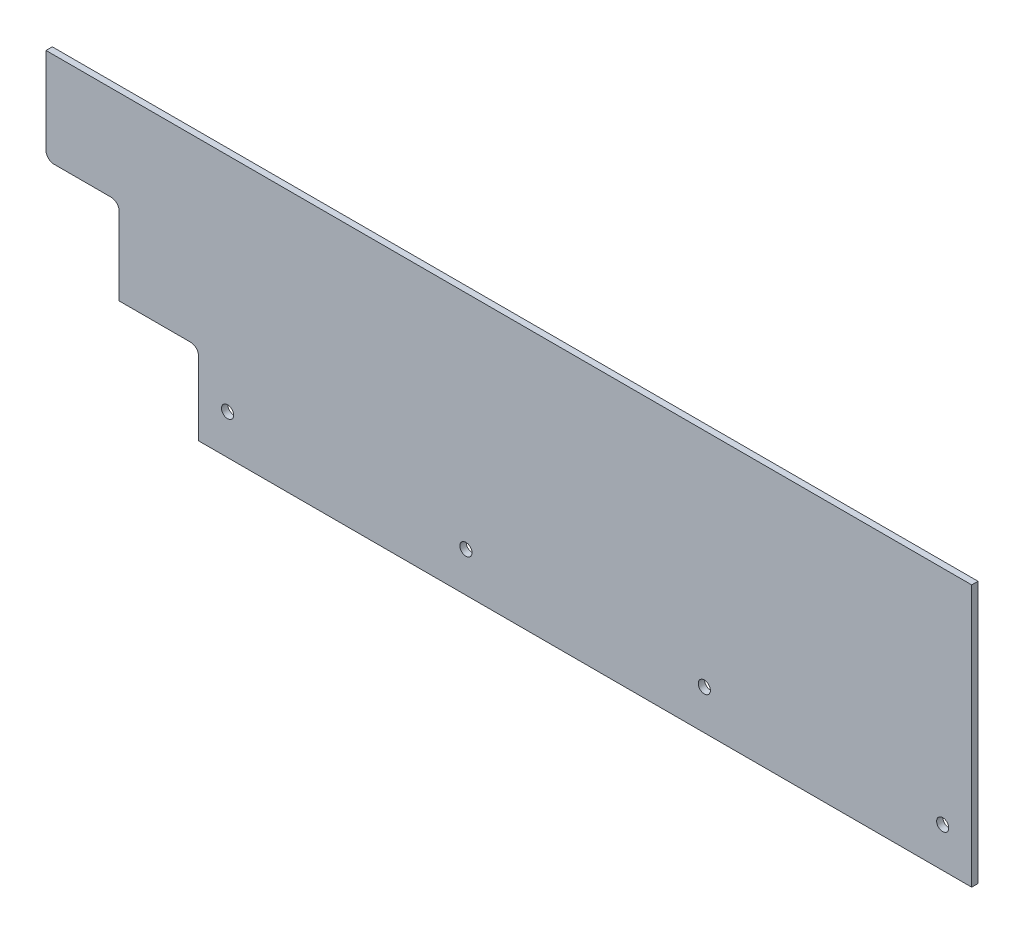
ISO-10303-21;
HEADER;
FILE_DESCRIPTION(('STEP AP214'),'2;1');
FILE_NAME('part.step','',(''),(''),'','','');
FILE_SCHEMA(('AUTOMOTIVE_DESIGN { 1 0 10303 214 1 1 1 1 }'));
ENDSEC;
DATA;
#1=APPLICATION_CONTEXT('core data for automotive mechanical design processes');
#2=APPLICATION_PROTOCOL_DEFINITION('international standard','automotive_design',2000,#1);
#3=PRODUCT_CONTEXT('',#1,'mechanical');
#4=PRODUCT('Part','Part','',(#3));
#5=PRODUCT_RELATED_PRODUCT_CATEGORY('part','',(#4));
#6=PRODUCT_DEFINITION_FORMATION('','',#4);
#7=PRODUCT_DEFINITION_CONTEXT('part definition',#1,'design');
#8=PRODUCT_DEFINITION('design','',#6,#7);
#9=PRODUCT_DEFINITION_SHAPE('','',#8);
#10=(LENGTH_UNIT() NAMED_UNIT(*) SI_UNIT(.MILLI.,.METRE.));
#11=(NAMED_UNIT(*) PLANE_ANGLE_UNIT() SI_UNIT($,.RADIAN.));
#12=(NAMED_UNIT(*) SI_UNIT($,.STERADIAN.) SOLID_ANGLE_UNIT());
#13=UNCERTAINTY_MEASURE_WITH_UNIT(LENGTH_MEASURE(1.E-05),#10,'distance_accuracy_value','');
#14=(GEOMETRIC_REPRESENTATION_CONTEXT(3) GLOBAL_UNCERTAINTY_ASSIGNED_CONTEXT((#13)) GLOBAL_UNIT_ASSIGNED_CONTEXT((#10,
#11,#12)) REPRESENTATION_CONTEXT('',''));
#15=CARTESIAN_POINT('',(0.,0.,0.));
#16=DIRECTION('',(0.,0.,1.));
#17=DIRECTION('',(1.,0.,0.));
#18=AXIS2_PLACEMENT_3D('',#15,#16,#17);
#19=CARTESIAN_POINT('',(-465.99999999998,1.11022302462516E-13,3.17500000000021));
#20=DIRECTION('',(-0.999999999999974,0.,0.));
#21=DIRECTION('',(0.,0.,0.999999999999972));
#22=AXIS2_PLACEMENT_3D('',#19,#20,#21);
#23=PLANE('',#22);
#24=DIRECTION('',(0.,0.999999999999998,0.));
#25=VECTOR('',#24,1.);
#26=CARTESIAN_POINT('',(-465.99999999998,1.66533453693773E-13,1.11022302462516E-13));
#27=LINE('',#26,#25);
#28=CARTESIAN_POINT('',(-465.999999999987,88.2,1.66533453693773E-13));
#29=VERTEX_POINT('',#28);
#30=CARTESIAN_POINT('',(-465.999999999987,131.8,3.33066907387547E-13));
#31=VERTEX_POINT('',#30);
#32=EDGE_CURVE('E169',#29,#31,#27,.T.);
#33=ORIENTED_EDGE('',*,*,#32,.F.);
#34=DIRECTION('',(0.,0.,-0.999999999999972));
#35=VECTOR('',#34,1.);
#36=CARTESIAN_POINT('',(-465.999999999987,88.1999999999999,3.17500000000026));
#37=LINE('',#36,#35);
#38=CARTESIAN_POINT('',(-465.999999999987,88.1999999999999,3.17500000000026));
#39=VERTEX_POINT('',#38);
#40=EDGE_CURVE('E13',#39,#29,#37,.T.);
#41=ORIENTED_EDGE('',*,*,#40,.F.);
#42=DIRECTION('',(0.,0.999999999999998,0.));
#43=VECTOR('',#42,1.);
#44=CARTESIAN_POINT('',(-465.99999999998,1.11022302462516E-13,3.17500000000021));
#45=LINE('',#44,#43);
#46=CARTESIAN_POINT('',(-465.999999999987,131.8,3.17499999999993));
#47=VERTEX_POINT('',#46);
#48=EDGE_CURVE('E237',#39,#47,#45,.T.);
#49=ORIENTED_EDGE('',*,*,#48,.T.);
#50=DIRECTION('',(0.,0.,-0.999999999999972));
#51=VECTOR('',#50,1.);
#52=CARTESIAN_POINT('',(-465.999999999987,131.8,3.17499999999993));
#53=LINE('',#52,#51);
#54=EDGE_CURVE('E59',#47,#31,#53,.T.);
#55=ORIENTED_EDGE('',*,*,#54,.T.);
#56=EDGE_LOOP('',(#33,#41,#49,#55));
#57=FACE_BOUND('',#56,.T.);
#58=ADVANCED_FACE('F42',(#57),#23,.T.);
#59=CARTESIAN_POINT('',(-461.999999999987,88.1999999999996,3.17499999999965));
#60=DIRECTION('',(0.,0.,-0.999999999999972));
#61=DIRECTION('',(-0.999999999999974,0.,0.));
#62=AXIS2_PLACEMENT_3D('',#59,#60,#61);
#63=CYLINDRICAL_SURFACE('',#62,4.);
#64=CARTESIAN_POINT('',(-461.999999999987,88.1999999999996,3.33066907387547E-13));
#65=DIRECTION('',(0.,0.,0.999999999999972));
#66=DIRECTION('',(0.999999999999974,0.,0.));
#67=AXIS2_PLACEMENT_3D('',#64,#65,#66);
#68=CIRCLE('',#67,4.);
#69=CARTESIAN_POINT('',(-461.99999999998,84.1999999999995,4.9960036108132E-13));
#70=VERTEX_POINT('',#69);
#71=EDGE_CURVE('E171',#29,#70,#68,.T.);
#72=ORIENTED_EDGE('',*,*,#71,.T.);
#73=DIRECTION('',(0.,0.,-0.999999999999972));
#74=VECTOR('',#73,1.);
#75=CARTESIAN_POINT('',(-461.999999999981,84.2,3.17499999999993));
#76=LINE('',#75,#74);
#77=CARTESIAN_POINT('',(-461.999999999981,84.2,3.17499999999993));
#78=VERTEX_POINT('',#77);
#79=EDGE_CURVE('E51',#78,#70,#76,.T.);
#80=ORIENTED_EDGE('',*,*,#79,.F.);
#81=CARTESIAN_POINT('',(-461.999999999987,88.1999999999996,3.17499999999965));
#82=DIRECTION('',(0.,0.,0.999999999999972));
#83=DIRECTION('',(0.999999999999974,0.,0.));
#84=AXIS2_PLACEMENT_3D('',#81,#82,#83);
#85=CIRCLE('',#84,4.);
#86=EDGE_CURVE('E233',#39,#78,#85,.T.);
#87=ORIENTED_EDGE('',*,*,#86,.F.);
#88=ORIENTED_EDGE('',*,*,#40,.T.);
#89=EDGE_LOOP('',(#72,#80,#87,#88));
#90=FACE_BOUND('',#89,.T.);
#91=ADVANCED_FACE('F221',(#90),#63,.T.);
#92=CARTESIAN_POINT('',(1.2490009027033E-13,84.1999999999989,3.17499999999998));
#93=DIRECTION('',(0.,-0.999999999999998,0.));
#94=DIRECTION('',(0.999999999999974,0.,0.));
#95=AXIS2_PLACEMENT_3D('',#92,#93,#94);
#96=PLANE('',#95);
#97=DIRECTION('',(-0.999999999999974,0.,0.));
#98=VECTOR('',#97,1.);
#99=CARTESIAN_POINT('',(1.31838984174237E-13,84.1999999999995,0.));
#100=LINE('',#99,#98);
#101=CARTESIAN_POINT('',(-433.199999999984,84.1999999999872,4.9960036108132E-13));
#102=VERTEX_POINT('',#101);
#103=EDGE_CURVE('E174',#102,#70,#100,.T.);
#104=ORIENTED_EDGE('',*,*,#103,.F.);
#105=DIRECTION('',(0.,0.,-0.999999999999972));
#106=VECTOR('',#105,1.);
#107=CARTESIAN_POINT('',(-433.199999999984,84.1999999999872,3.17500000000004));
#108=LINE('',#107,#106);
#109=CARTESIAN_POINT('',(-433.199999999984,84.1999999999872,3.17500000000004));
#110=VERTEX_POINT('',#109);
#111=EDGE_CURVE('E211',#110,#102,#108,.T.);
#112=ORIENTED_EDGE('',*,*,#111,.F.);
#113=DIRECTION('',(-0.999999999999974,0.,0.));
#114=VECTOR('',#113,1.);
#115=CARTESIAN_POINT('',(1.2490009027033E-13,84.1999999999989,3.17499999999998));
#116=LINE('',#115,#114);
#117=EDGE_CURVE('E218',#110,#78,#116,.T.);
#118=ORIENTED_EDGE('',*,*,#117,.T.);
#119=ORIENTED_EDGE('',*,*,#79,.T.);
#120=EDGE_LOOP('',(#104,#112,#118,#119));
#121=FACE_BOUND('',#120,.T.);
#122=ADVANCED_FACE('F216',(#121),#96,.T.);
#123=CARTESIAN_POINT('',(-433.199999999984,80.1999999999871,3.17499999999993));
#124=DIRECTION('',(0.,0.,-0.999999999999972));
#125=DIRECTION('',(-0.999999999999974,0.,0.));
#126=AXIS2_PLACEMENT_3D('',#123,#124,#125);
#127=CYLINDRICAL_SURFACE('',#126,3.99999999999997);
#128=CARTESIAN_POINT('',(-433.199999999984,80.1999999999872,1.11022302462516E-13));
#129=DIRECTION('',(0.,0.,0.999999999999972));
#130=DIRECTION('',(0.999999999999974,0.,0.));
#131=AXIS2_PLACEMENT_3D('',#128,#129,#130);
#132=CIRCLE('',#131,3.99999999999997);
#133=CARTESIAN_POINT('',(-429.199999999983,80.1999999999995,2.77555756156289E-13));
#134=VERTEX_POINT('',#133);
#135=EDGE_CURVE('E177',#134,#102,#132,.T.);
#136=ORIENTED_EDGE('',*,*,#135,.F.);
#137=DIRECTION('',(0.,0.,-0.999999999999972));
#138=VECTOR('',#137,1.);
#139=CARTESIAN_POINT('',(-429.199999999984,80.1999999999995,3.17499999999987));
#140=LINE('',#139,#138);
#141=CARTESIAN_POINT('',(-429.199999999984,80.1999999999995,3.17499999999987));
#142=VERTEX_POINT('',#141);
#143=EDGE_CURVE('E209',#142,#134,#140,.T.);
#144=ORIENTED_EDGE('',*,*,#143,.F.);
#145=CARTESIAN_POINT('',(-433.199999999984,80.1999999999871,3.17499999999993));
#146=DIRECTION('',(0.,0.,0.999999999999972));
#147=DIRECTION('',(0.999999999999974,0.,0.));
#148=AXIS2_PLACEMENT_3D('',#145,#146,#147);
#149=CIRCLE('',#148,3.99999999999997);
#150=EDGE_CURVE('E231',#142,#110,#149,.T.);
#151=ORIENTED_EDGE('',*,*,#150,.T.);
#152=ORIENTED_EDGE('',*,*,#111,.T.);
#153=EDGE_LOOP('',(#136,#144,#151,#152));
#154=FACE_BOUND('',#153,.T.);
#155=ADVANCED_FACE('F227',(#154),#127,.F.);
#156=CARTESIAN_POINT('',(-429.199999999984,-4.9960036108132E-13,3.17499999999987));
#157=DIRECTION('',(0.999999999999974,0.,0.));
#158=DIRECTION('',(0.,0.999999999999998,0.));
#159=AXIS2_PLACEMENT_3D('',#156,#157,#158);
#160=PLANE('',#159);
#161=DIRECTION('',(0.,-0.999999999999998,0.));
#162=VECTOR('',#161,1.);
#163=CARTESIAN_POINT('',(-429.199999999983,-5.55111512312578E-13,3.33066907387547E-13));
#164=LINE('',#163,#162);
#165=CARTESIAN_POINT('',(-429.199999999984,41.,2.22044604925031E-13));
#166=VERTEX_POINT('',#165);
#167=EDGE_CURVE('E180',#134,#166,#164,.T.);
#168=ORIENTED_EDGE('',*,*,#167,.T.);
#169=DIRECTION('',(0.,0.,-0.999999999999972));
#170=VECTOR('',#169,1.);
#171=CARTESIAN_POINT('',(-429.199999999984,40.9999999999999,3.17500000000004));
#172=LINE('',#171,#170);
#173=CARTESIAN_POINT('',(-429.199999999984,40.9999999999999,3.17500000000004));
#174=VERTEX_POINT('',#173);
#175=EDGE_CURVE('E206',#174,#166,#172,.T.);
#176=ORIENTED_EDGE('',*,*,#175,.F.);
#177=DIRECTION('',(0.,-0.999999999999998,0.));
#178=VECTOR('',#177,1.);
#179=CARTESIAN_POINT('',(-429.199999999984,-4.9960036108132E-13,3.17499999999987));
#180=LINE('',#179,#178);
#181=EDGE_CURVE('E235',#142,#174,#180,.T.);
#182=ORIENTED_EDGE('',*,*,#181,.F.);
#183=ORIENTED_EDGE('',*,*,#143,.T.);
#184=EDGE_LOOP('',(#168,#176,#182,#183));
#185=FACE_BOUND('',#184,.T.);
#186=ADVANCED_FACE('F352',(#185),#160,.F.);
#187=CARTESIAN_POINT('',(0.,40.9999999999995,3.17500000000009));
#188=DIRECTION('',(0.,0.999999999999998,0.));
#189=DIRECTION('',(-0.999999999999974,0.,0.));
#190=AXIS2_PLACEMENT_3D('',#187,#188,#189);
#191=PLANE('',#190);
#192=DIRECTION('',(0.999999999999974,0.,0.));
#193=VECTOR('',#192,1.);
#194=CARTESIAN_POINT('',(-1.52655665885959E-13,40.9999999999996,1.11022302462516E-13));
#195=LINE('',#194,#193);
#196=CARTESIAN_POINT('',(-393.199999999987,40.9999999999998,2.22044604925031E-13));
#197=VERTEX_POINT('',#196);
#198=EDGE_CURVE('E183',#166,#197,#195,.T.);
#199=ORIENTED_EDGE('',*,*,#198,.T.);
#200=DIRECTION('',(0.,0.,-0.999999999999972));
#201=VECTOR('',#200,1.);
#202=CARTESIAN_POINT('',(-393.199999999987,41.0000000000001,3.17500000000004));
#203=LINE('',#202,#201);
#204=CARTESIAN_POINT('',(-393.199999999987,41.0000000000001,3.17500000000004));
#205=VERTEX_POINT('',#204);
#206=EDGE_CURVE('E204',#205,#197,#203,.T.);
#207=ORIENTED_EDGE('',*,*,#206,.F.);
#208=DIRECTION('',(0.999999999999974,0.,0.));
#209=VECTOR('',#208,1.);
#210=CARTESIAN_POINT('',(0.,40.9999999999995,3.17500000000009));
#211=LINE('',#210,#209);
#212=EDGE_CURVE('E242',#174,#205,#211,.T.);
#213=ORIENTED_EDGE('',*,*,#212,.F.);
#214=ORIENTED_EDGE('',*,*,#175,.T.);
#215=EDGE_LOOP('',(#199,#207,#213,#214));
#216=FACE_BOUND('',#215,.T.);
#217=ADVANCED_FACE('F250',(#216),#191,.F.);
#218=CARTESIAN_POINT('',(-393.199999999987,36.9999999999998,3.17500000000009));
#219=DIRECTION('',(0.,0.,-0.999999999999972));
#220=DIRECTION('',(-0.999999999999974,0.,0.));
#221=AXIS2_PLACEMENT_3D('',#218,#219,#220);
#222=CYLINDRICAL_SURFACE('',#221,4.00000000000002);
#223=CARTESIAN_POINT('',(-393.199999999987,36.9999999999996,2.22044604925031E-13));
#224=DIRECTION('',(0.,0.,0.999999999999972));
#225=DIRECTION('',(0.999999999999974,0.,0.));
#226=AXIS2_PLACEMENT_3D('',#223,#224,#225);
#227=CIRCLE('',#226,4.00000000000002);
#228=CARTESIAN_POINT('',(-389.199999999987,36.9999999999869,-1.66533453693773E-13));
#229=VERTEX_POINT('',#228);
#230=EDGE_CURVE('E186',#229,#197,#227,.T.);
#231=ORIENTED_EDGE('',*,*,#230,.F.);
#232=DIRECTION('',(0.,0.,-0.999999999999972));
#233=VECTOR('',#232,1.);
#234=CARTESIAN_POINT('',(-389.199999999987,36.9999999999869,3.17499999999993));
#235=LINE('',#234,#233);
#236=CARTESIAN_POINT('',(-389.199999999987,36.9999999999869,3.17499999999993));
#237=VERTEX_POINT('',#236);
#238=EDGE_CURVE('E202',#237,#229,#235,.T.);
#239=ORIENTED_EDGE('',*,*,#238,.F.);
#240=CARTESIAN_POINT('',(-393.199999999987,36.9999999999998,3.17500000000009));
#241=DIRECTION('',(0.,0.,0.999999999999972));
#242=DIRECTION('',(0.999999999999974,0.,0.));
#243=AXIS2_PLACEMENT_3D('',#240,#241,#242);
#244=CIRCLE('',#243,4.00000000000002);
#245=EDGE_CURVE('E152',#237,#205,#244,.T.);
#246=ORIENTED_EDGE('',*,*,#245,.T.);
#247=ORIENTED_EDGE('',*,*,#206,.T.);
#248=EDGE_LOOP('',(#231,#239,#246,#247));
#249=FACE_BOUND('',#248,.T.);
#250=ADVANCED_FACE('F246',(#249),#222,.F.);
#251=CARTESIAN_POINT('',(-389.199999999987,6.66133814775094E-13,3.17500000000004));
#252=DIRECTION('',(0.999999999999974,0.,0.));
#253=DIRECTION('',(0.,0.999999999999998,0.));
#254=AXIS2_PLACEMENT_3D('',#251,#252,#253);
#255=PLANE('',#254);
#256=DIRECTION('',(0.,-0.999999999999998,0.));
#257=VECTOR('',#256,1.);
#258=CARTESIAN_POINT('',(-389.199999999987,5.55111512312578E-13,1.66533453693773E-13));
#259=LINE('',#258,#257);
#260=CARTESIAN_POINT('',(-389.199999999987,0.,2.77555756156289E-13));
#261=VERTEX_POINT('',#260);
#262=EDGE_CURVE('E189',#229,#261,#259,.T.);
#263=ORIENTED_EDGE('',*,*,#262,.T.);
#264=DIRECTION('',(0.,0.,-0.999999999999972));
#265=VECTOR('',#264,1.);
#266=CARTESIAN_POINT('',(-389.199999999987,1.66533453693773E-13,3.17500000000009));
#267=LINE('',#266,#265);
#268=CARTESIAN_POINT('',(-389.199999999987,1.66533453693773E-13,3.17500000000009));
#269=VERTEX_POINT('',#268);
#270=EDGE_CURVE('E137',#269,#261,#267,.T.);
#271=ORIENTED_EDGE('',*,*,#270,.F.);
#272=DIRECTION('',(0.,-0.999999999999998,0.));
#273=VECTOR('',#272,1.);
#274=CARTESIAN_POINT('',(-389.199999999987,6.66133814775094E-13,3.17500000000004));
#275=LINE('',#274,#273);
#276=EDGE_CURVE('E149',#237,#269,#275,.T.);
#277=ORIENTED_EDGE('',*,*,#276,.F.);
#278=ORIENTED_EDGE('',*,*,#238,.T.);
#279=EDGE_LOOP('',(#263,#271,#277,#278));
#280=FACE_BOUND('',#279,.T.);
#281=ADVANCED_FACE('F253',(#280),#255,.F.);
#282=CARTESIAN_POINT('',(0.,1.11022302462516E-13,3.17499999999993));
#283=DIRECTION('',(0.,-0.999999999999998,0.));
#284=DIRECTION('',(0.,0.,-0.999999999999972));
#285=AXIS2_PLACEMENT_3D('',#282,#283,#284);
#286=PLANE('',#285);
#287=DIRECTION('',(-0.999999999999974,0.,0.));
#288=VECTOR('',#287,1.);
#289=CARTESIAN_POINT('',(0.,0.,0.));
#290=LINE('',#289,#288);
#291=CARTESIAN_POINT('',(0.,0.,0.));
#292=VERTEX_POINT('',#291);
#293=EDGE_CURVE('E134',#292,#261,#290,.T.);
#294=ORIENTED_EDGE('',*,*,#293,.F.);
#295=DIRECTION('',(0.,0.,-0.999999999999972));
#296=VECTOR('',#295,1.);
#297=CARTESIAN_POINT('',(0.,1.11022302462516E-13,3.17499999999993));
#298=LINE('',#297,#296);
#299=CARTESIAN_POINT('',(0.,1.11022302462516E-13,3.17499999999993));
#300=VERTEX_POINT('',#299);
#301=EDGE_CURVE('E128',#300,#292,#298,.T.);
#302=ORIENTED_EDGE('',*,*,#301,.F.);
#303=DIRECTION('',(-0.999999999999974,0.,0.));
#304=VECTOR('',#303,1.);
#305=CARTESIAN_POINT('',(0.,1.11022302462516E-13,3.17499999999993));
#306=LINE('',#305,#304);
#307=EDGE_CURVE('E132',#300,#269,#306,.T.);
#308=ORIENTED_EDGE('',*,*,#307,.T.);
#309=ORIENTED_EDGE('',*,*,#270,.T.);
#310=EDGE_LOOP('',(#294,#302,#308,#309));
#311=FACE_BOUND('',#310,.T.);
#312=ADVANCED_FACE('F130',(#311),#286,.T.);
#313=CARTESIAN_POINT('',(0.,1.11022302462516E-13,3.17499999999993));
#314=DIRECTION('',(-0.999999999999974,0.,0.));
#315=DIRECTION('',(0.,0.,0.999999999999972));
#316=AXIS2_PLACEMENT_3D('',#313,#314,#315);
#317=PLANE('',#316);
#318=DIRECTION('',(0.,0.999999999999998,0.));
#319=VECTOR('',#318,1.);
#320=CARTESIAN_POINT('',(0.,0.,0.));
#321=LINE('',#320,#319);
#322=CARTESIAN_POINT('',(0.,131.8,0.));
#323=VERTEX_POINT('',#322);
#324=EDGE_CURVE('E193',#292,#323,#321,.T.);
#325=ORIENTED_EDGE('',*,*,#324,.T.);
#326=DIRECTION('',(0.,0.,-0.999999999999972));
#327=VECTOR('',#326,1.);
#328=CARTESIAN_POINT('',(0.,131.8,3.17499999999982));
#329=LINE('',#328,#327);
#330=CARTESIAN_POINT('',(0.,131.8,3.17499999999982));
#331=VERTEX_POINT('',#330);
#332=EDGE_CURVE('E94',#331,#323,#329,.T.);
#333=ORIENTED_EDGE('',*,*,#332,.F.);
#334=DIRECTION('',(0.,0.999999999999998,0.));
#335=VECTOR('',#334,1.);
#336=CARTESIAN_POINT('',(0.,1.11022302462516E-13,3.17499999999993));
#337=LINE('',#336,#335);
#338=EDGE_CURVE('E139',#300,#331,#337,.T.);
#339=ORIENTED_EDGE('',*,*,#338,.F.);
#340=ORIENTED_EDGE('',*,*,#301,.T.);
#341=EDGE_LOOP('',(#325,#333,#339,#340));
#342=FACE_BOUND('',#341,.T.);
#343=ADVANCED_FACE('F140',(#342),#317,.F.);
#344=CARTESIAN_POINT('',(-374.59999999999,19.9999999999998,3.17500000000009));
#345=DIRECTION('',(0.,0.,-0.999999999999972));
#346=DIRECTION('',(-0.999999999999974,0.,0.));
#347=AXIS2_PLACEMENT_3D('',#344,#345,#346);
#348=CYLINDRICAL_SURFACE('',#347,3.05000000000002);
#349=CARTESIAN_POINT('',(-374.59999999999,19.9999999999998,3.17500000000009));
#350=DIRECTION('',(0.,0.,0.999999999999972));
#351=DIRECTION('',(0.999999999999974,0.,0.));
#352=AXIS2_PLACEMENT_3D('',#349,#350,#351);
#353=CIRCLE('',#352,3.05000000000002);
#354=CARTESIAN_POINT('',(-377.64999999999,19.9999999999998,3.17500000000009));
#355=VERTEX_POINT('',#354);
#356=EDGE_CURVE('E390',#355,#355,#353,.T.);
#357=CARTESIAN_POINT('',(-374.59999999999,20.0000000000001,1.66533453693773E-13));
#358=DIRECTION('',(0.,0.,0.999999999999972));
#359=DIRECTION('',(0.999999999999974,0.,0.));
#360=AXIS2_PLACEMENT_3D('',#357,#358,#359);
#361=CIRCLE('',#360,3.05000000000002);
#362=CARTESIAN_POINT('',(-377.64999999999,19.9999999999998,1.66533453693773E-13));
#363=VERTEX_POINT('',#362);
#364=EDGE_CURVE('E166',#363,#363,#361,.T.);
#365=CARTESIAN_POINT('',(-377.64999999999,19.9999999999998,3.17500000000009));
#366=CARTESIAN_POINT('',(-377.64999999999,19.9999999999998,3.14192708333343));
#367=CARTESIAN_POINT('',(-377.64999999999,19.9999999999998,3.10885416666676));
#368=CARTESIAN_POINT('',(-377.64999999999,19.9999999999998,3.04270833333343));
#369=CARTESIAN_POINT('',(-377.64999999999,19.9999999999998,3.00963541666676));
#370=CARTESIAN_POINT('',(-377.64999999999,19.9999999999998,2.94348958333343));
#371=CARTESIAN_POINT('',(-377.64999999999,19.9999999999998,2.91041666666677));
#372=CARTESIAN_POINT('',(-377.64999999999,19.9999999999998,2.84427083333344));
#373=CARTESIAN_POINT('',(-377.64999999999,19.9999999999998,2.81119791666677));
#374=CARTESIAN_POINT('',(-377.64999999999,19.9999999999998,2.74505208333344));
#375=CARTESIAN_POINT('',(-377.64999999999,19.9999999999998,2.71197916666677));
#376=CARTESIAN_POINT('',(-377.64999999999,19.9999999999998,2.64583333333344));
#377=CARTESIAN_POINT('',(-377.64999999999,19.9999999999998,2.61276041666677));
#378=CARTESIAN_POINT('',(-377.64999999999,19.9999999999998,2.54661458333344));
#379=CARTESIAN_POINT('',(-377.64999999999,19.9999999999998,2.51354166666678));
#380=CARTESIAN_POINT('',(-377.64999999999,19.9999999999998,2.44739583333344));
#381=CARTESIAN_POINT('',(-377.64999999999,19.9999999999998,2.41432291666678));
#382=CARTESIAN_POINT('',(-377.64999999999,19.9999999999998,2.34817708333345));
#383=CARTESIAN_POINT('',(-377.64999999999,19.9999999999998,2.31510416666678));
#384=CARTESIAN_POINT('',(-377.64999999999,19.9999999999998,2.24895833333345));
#385=CARTESIAN_POINT('',(-377.64999999999,19.9999999999998,2.21588541666678));
#386=CARTESIAN_POINT('',(-377.64999999999,19.9999999999998,2.14973958333345));
#387=CARTESIAN_POINT('',(-377.64999999999,19.9999999999998,2.11666666666679));
#388=CARTESIAN_POINT('',(-377.64999999999,19.9999999999998,2.05052083333345));
#389=CARTESIAN_POINT('',(-377.64999999999,19.9999999999998,2.01744791666679));
#390=CARTESIAN_POINT('',(-377.64999999999,19.9999999999998,1.95130208333346));
#391=CARTESIAN_POINT('',(-377.64999999999,19.9999999999998,1.91822916666679));
#392=CARTESIAN_POINT('',(-377.64999999999,19.9999999999998,1.85208333333346));
#393=CARTESIAN_POINT('',(-377.64999999999,19.9999999999998,1.81901041666679));
#394=CARTESIAN_POINT('',(-377.64999999999,19.9999999999998,1.75286458333346));
#395=CARTESIAN_POINT('',(-377.64999999999,19.9999999999998,1.71979166666679));
#396=CARTESIAN_POINT('',(-377.64999999999,19.9999999999998,1.65364583333346));
#397=CARTESIAN_POINT('',(-377.64999999999,19.9999999999998,1.6205729166668));
#398=CARTESIAN_POINT('',(-377.64999999999,19.9999999999998,1.55442708333346));
#399=CARTESIAN_POINT('',(-377.64999999999,19.9999999999998,1.5213541666668));
#400=CARTESIAN_POINT('',(-377.64999999999,19.9999999999998,1.45520833333347));
#401=CARTESIAN_POINT('',(-377.64999999999,19.9999999999998,1.4221354166668));
#402=CARTESIAN_POINT('',(-377.64999999999,19.9999999999998,1.35598958333347));
#403=CARTESIAN_POINT('',(-377.64999999999,19.9999999999998,1.3229166666668));
#404=CARTESIAN_POINT('',(-377.64999999999,19.9999999999998,1.25677083333347));
#405=CARTESIAN_POINT('',(-377.64999999999,19.9999999999998,1.22369791666681));
#406=CARTESIAN_POINT('',(-377.64999999999,19.9999999999998,1.15755208333347));
#407=CARTESIAN_POINT('',(-377.64999999999,19.9999999999998,1.12447916666681));
#408=CARTESIAN_POINT('',(-377.64999999999,19.9999999999998,1.05833333333348));
#409=CARTESIAN_POINT('',(-377.64999999999,19.9999999999998,1.02526041666681));
#410=CARTESIAN_POINT('',(-377.64999999999,19.9999999999998,0.959114583333478));
#411=CARTESIAN_POINT('',(-377.64999999999,19.9999999999998,0.926041666666812));
#412=CARTESIAN_POINT('',(-377.64999999999,19.9999999999998,0.85989583333348));
#413=CARTESIAN_POINT('',(-377.64999999999,19.9999999999998,0.826822916666814));
#414=CARTESIAN_POINT('',(-377.64999999999,19.9999999999998,0.760677083333482));
#415=CARTESIAN_POINT('',(-377.64999999999,19.9999999999998,0.727604166666816));
#416=CARTESIAN_POINT('',(-377.64999999999,19.9999999999998,0.661458333333485));
#417=CARTESIAN_POINT('',(-377.64999999999,19.9999999999998,0.628385416666819));
#418=CARTESIAN_POINT('',(-377.64999999999,19.9999999999998,0.562239583333487));
#419=CARTESIAN_POINT('',(-377.64999999999,19.9999999999998,0.529166666666821));
#420=CARTESIAN_POINT('',(-377.64999999999,19.9999999999998,0.463020833333489));
#421=CARTESIAN_POINT('',(-377.64999999999,19.9999999999998,0.429947916666823));
#422=CARTESIAN_POINT('',(-377.64999999999,19.9999999999998,0.363802083333492));
#423=CARTESIAN_POINT('',(-377.64999999999,19.9999999999998,0.330729166666826));
#424=CARTESIAN_POINT('',(-377.64999999999,19.9999999999998,0.264583333333494));
#425=CARTESIAN_POINT('',(-377.64999999999,19.9999999999998,0.231510416666828));
#426=CARTESIAN_POINT('',(-377.64999999999,19.9999999999998,0.165364583333496));
#427=CARTESIAN_POINT('',(-377.64999999999,19.9999999999998,0.13229166666683));
#428=CARTESIAN_POINT('',(-377.64999999999,19.9999999999998,0.0661458333334984));
#429=CARTESIAN_POINT('',(-377.64999999999,19.9999999999998,0.0330729166668325));
#430=CARTESIAN_POINT('',(-377.64999999999,19.9999999999998,1.66533453693773E-13));
#431=B_SPLINE_CURVE_WITH_KNOTS('',3,(#365,#366,#367,#368,#369,#370,#371,#372,#373,#374,#375,
#376,#377,#378,#379,#380,#381,#382,#383,#384,#385,#386,#387,#388,#389,#390,#391,#392,#393,#394,
#395,#396,#397,#398,#399,#400,#401,#402,#403,#404,#405,#406,#407,#408,#409,#410,#411,#412,#413,
#414,#415,#416,#417,#418,#419,#420,#421,#422,#423,#424,#425,#426,#427,#428,#429,#430),
.UNSPECIFIED.,.F.,.F.,(4,2,2,2,2,2,2,2,2,2,2,2,2,2,2,2,2,2,2,2,2,2,2,2,2,2,2,2,2,2,2,2,4),(0.,
0.0992187499999973,0.198437499999995,0.297656249999993,0.396874999999991,0.496093749999988,
0.595312499999986,0.694531249999984,0.793749999999982,0.892968749999979,0.992187499999977,
1.09140624999997,1.19062499999997,1.28984374999997,1.38906249999997,1.48828124999997,
1.58749999999996,1.68671874999996,1.78593749999996,1.88515624999996,1.98437499999995,
2.08359374999995,2.18281249999995,2.28203124999995,2.38124999999995,2.48046874999994,
2.57968749999994,2.67890624999994,2.77812499999994,2.87734374999993,2.97656249999993,
3.07578124999993,3.17499999999993),.UNSPECIFIED.);
#432=EDGE_CURVE('BSEAM270',#355,#363,#431,.T.);
#433=ORIENTED_EDGE('',*,*,#356,.T.);
#434=ORIENTED_EDGE('',*,*,#364,.F.);
#435=ORIENTED_EDGE('',*,*,#432,.T.);
#436=ORIENTED_EDGE('',*,*,#432,.F.);
#437=EDGE_LOOP('',(#433,#435,#434,#436));
#438=FACE_BOUND('',#437,.T.);
#439=ADVANCED_FACE('F270',(#438),#348,.F.);
#440=CARTESIAN_POINT('',(-254.59999999999,20.000000000001,3.17500000000004));
#441=DIRECTION('',(0.,0.,-0.999999999999972));
#442=DIRECTION('',(-0.999999999999974,0.,0.));
#443=AXIS2_PLACEMENT_3D('',#440,#441,#442);
#444=CYLINDRICAL_SURFACE('',#443,3.05000000000002);
#445=CARTESIAN_POINT('',(-254.59999999999,20.000000000001,3.17500000000004));
#446=DIRECTION('',(0.,0.,0.999999999999972));
#447=DIRECTION('',(0.999999999999974,0.,0.));
#448=AXIS2_PLACEMENT_3D('',#445,#446,#447);
#449=CIRCLE('',#448,3.05000000000002);
#450=CARTESIAN_POINT('',(-257.64999999999,20.000000000001,3.17500000000004));
#451=VERTEX_POINT('',#450);
#452=EDGE_CURVE('E387',#451,#451,#449,.T.);
#453=CARTESIAN_POINT('',(-254.59999999999,20.0000000000005,1.11022302462516E-13));
#454=DIRECTION('',(0.,0.,0.999999999999972));
#455=DIRECTION('',(0.999999999999974,0.,0.));
#456=AXIS2_PLACEMENT_3D('',#453,#454,#455);
#457=CIRCLE('',#456,3.05000000000002);
#458=CARTESIAN_POINT('',(-257.64999999999,20.000000000001,1.11022302462516E-13));
#459=VERTEX_POINT('',#458);
#460=EDGE_CURVE('E163',#459,#459,#457,.T.);
#461=CARTESIAN_POINT('',(-257.64999999999,20.000000000001,3.17500000000004));
#462=CARTESIAN_POINT('',(-257.64999999999,20.000000000001,3.14192708333337));
#463=CARTESIAN_POINT('',(-257.64999999999,20.000000000001,3.10885416666671));
#464=CARTESIAN_POINT('',(-257.64999999999,20.000000000001,3.04270833333338));
#465=CARTESIAN_POINT('',(-257.64999999999,20.000000000001,3.00963541666671));
#466=CARTESIAN_POINT('',(-257.64999999999,20.000000000001,2.94348958333338));
#467=CARTESIAN_POINT('',(-257.64999999999,20.000000000001,2.91041666666671));
#468=CARTESIAN_POINT('',(-257.64999999999,20.000000000001,2.84427083333338));
#469=CARTESIAN_POINT('',(-257.64999999999,20.000000000001,2.81119791666671));
#470=CARTESIAN_POINT('',(-257.64999999999,20.000000000001,2.74505208333338));
#471=CARTESIAN_POINT('',(-257.64999999999,20.000000000001,2.71197916666672));
#472=CARTESIAN_POINT('',(-257.64999999999,20.000000000001,2.64583333333338));
#473=CARTESIAN_POINT('',(-257.64999999999,20.000000000001,2.61276041666672));
#474=CARTESIAN_POINT('',(-257.64999999999,20.000000000001,2.54661458333339));
#475=CARTESIAN_POINT('',(-257.64999999999,20.000000000001,2.51354166666672));
#476=CARTESIAN_POINT('',(-257.64999999999,20.000000000001,2.44739583333339));
#477=CARTESIAN_POINT('',(-257.64999999999,20.000000000001,2.41432291666672));
#478=CARTESIAN_POINT('',(-257.64999999999,20.000000000001,2.34817708333339));
#479=CARTESIAN_POINT('',(-257.64999999999,20.000000000001,2.31510416666673));
#480=CARTESIAN_POINT('',(-257.64999999999,20.000000000001,2.24895833333339));
#481=CARTESIAN_POINT('',(-257.64999999999,20.000000000001,2.21588541666673));
#482=CARTESIAN_POINT('',(-257.64999999999,20.000000000001,2.1497395833334));
#483=CARTESIAN_POINT('',(-257.64999999999,20.000000000001,2.11666666666673));
#484=CARTESIAN_POINT('',(-257.64999999999,20.000000000001,2.0505208333334));
#485=CARTESIAN_POINT('',(-257.64999999999,20.000000000001,2.01744791666673));
#486=CARTESIAN_POINT('',(-257.64999999999,20.000000000001,1.9513020833334));
#487=CARTESIAN_POINT('',(-257.64999999999,20.000000000001,1.91822916666673));
#488=CARTESIAN_POINT('',(-257.64999999999,20.000000000001,1.8520833333334));
#489=CARTESIAN_POINT('',(-257.64999999999,20.000000000001,1.81901041666674));
#490=CARTESIAN_POINT('',(-257.64999999999,20.000000000001,1.7528645833334));
#491=CARTESIAN_POINT('',(-257.64999999999,20.000000000001,1.71979166666674));
#492=CARTESIAN_POINT('',(-257.64999999999,20.000000000001,1.65364583333341));
#493=CARTESIAN_POINT('',(-257.64999999999,20.000000000001,1.62057291666674));
#494=CARTESIAN_POINT('',(-257.64999999999,20.000000000001,1.55442708333341));
#495=CARTESIAN_POINT('',(-257.64999999999,20.000000000001,1.52135416666674));
#496=CARTESIAN_POINT('',(-257.64999999999,20.000000000001,1.45520833333341));
#497=CARTESIAN_POINT('',(-257.64999999999,20.000000000001,1.42213541666675));
#498=CARTESIAN_POINT('',(-257.64999999999,20.000000000001,1.35598958333341));
#499=CARTESIAN_POINT('',(-257.64999999999,20.000000000001,1.32291666666675));
#500=CARTESIAN_POINT('',(-257.64999999999,20.000000000001,1.25677083333342));
#501=CARTESIAN_POINT('',(-257.64999999999,20.000000000001,1.22369791666675));
#502=CARTESIAN_POINT('',(-257.64999999999,20.000000000001,1.15755208333342));
#503=CARTESIAN_POINT('',(-257.64999999999,20.000000000001,1.12447916666675));
#504=CARTESIAN_POINT('',(-257.64999999999,20.000000000001,1.05833333333342));
#505=CARTESIAN_POINT('',(-257.64999999999,20.000000000001,1.02526041666675));
#506=CARTESIAN_POINT('',(-257.64999999999,20.000000000001,0.959114583333423));
#507=CARTESIAN_POINT('',(-257.64999999999,20.000000000001,0.926041666666757));
#508=CARTESIAN_POINT('',(-257.64999999999,20.000000000001,0.859895833333425));
#509=CARTESIAN_POINT('',(-257.64999999999,20.000000000001,0.826822916666759));
#510=CARTESIAN_POINT('',(-257.64999999999,20.000000000001,0.760677083333427));
#511=CARTESIAN_POINT('',(-257.64999999999,20.000000000001,0.727604166666761));
#512=CARTESIAN_POINT('',(-257.64999999999,20.000000000001,0.661458333333429));
#513=CARTESIAN_POINT('',(-257.64999999999,20.000000000001,0.628385416666763));
#514=CARTESIAN_POINT('',(-257.64999999999,20.000000000001,0.562239583333432));
#515=CARTESIAN_POINT('',(-257.64999999999,20.000000000001,0.529166666666766));
#516=CARTESIAN_POINT('',(-257.64999999999,20.000000000001,0.463020833333434));
#517=CARTESIAN_POINT('',(-257.64999999999,20.000000000001,0.429947916666768));
#518=CARTESIAN_POINT('',(-257.64999999999,20.000000000001,0.363802083333436));
#519=CARTESIAN_POINT('',(-257.64999999999,20.000000000001,0.33072916666677));
#520=CARTESIAN_POINT('',(-257.64999999999,20.000000000001,0.264583333333438));
#521=CARTESIAN_POINT('',(-257.64999999999,20.000000000001,0.231510416666773));
#522=CARTESIAN_POINT('',(-257.64999999999,20.000000000001,0.165364583333441));
#523=CARTESIAN_POINT('',(-257.64999999999,20.000000000001,0.132291666666775));
#524=CARTESIAN_POINT('',(-257.64999999999,20.000000000001,0.0661458333334429));
#525=CARTESIAN_POINT('',(-257.64999999999,20.000000000001,0.033072916666777));
#526=CARTESIAN_POINT('',(-257.64999999999,20.000000000001,1.11022302462516E-13));
#527=B_SPLINE_CURVE_WITH_KNOTS('',3,(#461,#462,#463,#464,#465,#466,#467,#468,#469,#470,#471,
#472,#473,#474,#475,#476,#477,#478,#479,#480,#481,#482,#483,#484,#485,#486,#487,#488,#489,#490,
#491,#492,#493,#494,#495,#496,#497,#498,#499,#500,#501,#502,#503,#504,#505,#506,#507,#508,#509,
#510,#511,#512,#513,#514,#515,#516,#517,#518,#519,#520,#521,#522,#523,#524,#525,#526),
.UNSPECIFIED.,.F.,.F.,(4,2,2,2,2,2,2,2,2,2,2,2,2,2,2,2,2,2,2,2,2,2,2,2,2,2,2,2,2,2,2,2,4),(0.,
0.0992187499999973,0.198437499999995,0.297656249999993,0.396874999999991,0.496093749999988,
0.595312499999986,0.694531249999984,0.793749999999982,0.892968749999979,0.992187499999977,
1.09140624999997,1.19062499999997,1.28984374999997,1.38906249999997,1.48828124999997,
1.58749999999996,1.68671874999996,1.78593749999996,1.88515624999996,1.98437499999995,
2.08359374999995,2.18281249999995,2.28203124999995,2.38124999999995,2.48046874999994,
2.57968749999994,2.67890624999994,2.77812499999994,2.87734374999993,2.97656249999993,
3.07578124999993,3.17499999999993),.UNSPECIFIED.);
#528=EDGE_CURVE('BSEAM273',#451,#459,#527,.T.);
#529=ORIENTED_EDGE('',*,*,#452,.T.);
#530=ORIENTED_EDGE('',*,*,#460,.F.);
#531=ORIENTED_EDGE('',*,*,#528,.T.);
#532=ORIENTED_EDGE('',*,*,#528,.F.);
#533=EDGE_LOOP('',(#529,#531,#530,#532));
#534=FACE_BOUND('',#533,.T.);
#535=ADVANCED_FACE('F273',(#534),#444,.F.);
#536=CARTESIAN_POINT('',(-134.599999999997,20.0000000000016,3.17500000000004));
#537=DIRECTION('',(0.,0.,-0.999999999999972));
#538=DIRECTION('',(-0.999999999999974,0.,0.));
#539=AXIS2_PLACEMENT_3D('',#536,#537,#538);
#540=CYLINDRICAL_SURFACE('',#539,3.04999999999999);
#541=CARTESIAN_POINT('',(-134.599999999997,20.0000000000016,3.17500000000004));
#542=DIRECTION('',(0.,0.,0.999999999999972));
#543=DIRECTION('',(0.999999999999974,0.,0.));
#544=AXIS2_PLACEMENT_3D('',#541,#542,#543);
#545=CIRCLE('',#544,3.04999999999999);
#546=CARTESIAN_POINT('',(-137.649999999997,20.0000000000016,3.17500000000004));
#547=VERTEX_POINT('',#546);
#548=EDGE_CURVE('E288',#547,#547,#545,.T.);
#549=CARTESIAN_POINT('',(-134.599999999997,20.0000000000016,2.22044604925031E-13));
#550=DIRECTION('',(0.,0.,0.999999999999972));
#551=DIRECTION('',(0.999999999999974,0.,0.));
#552=AXIS2_PLACEMENT_3D('',#549,#550,#551);
#553=CIRCLE('',#552,3.04999999999999);
#554=CARTESIAN_POINT('',(-137.649999999997,20.0000000000016,2.22044604925031E-13));
#555=VERTEX_POINT('',#554);
#556=EDGE_CURVE('E160',#555,#555,#553,.T.);
#557=CARTESIAN_POINT('',(-137.649999999997,20.0000000000016,3.17500000000004));
#558=CARTESIAN_POINT('',(-137.649999999997,20.0000000000016,3.14192708333337));
#559=CARTESIAN_POINT('',(-137.649999999997,20.0000000000016,3.10885416666671));
#560=CARTESIAN_POINT('',(-137.649999999997,20.0000000000016,3.04270833333338));
#561=CARTESIAN_POINT('',(-137.649999999997,20.0000000000016,3.00963541666672));
#562=CARTESIAN_POINT('',(-137.649999999997,20.0000000000016,2.94348958333339));
#563=CARTESIAN_POINT('',(-137.649999999997,20.0000000000016,2.91041666666672));
#564=CARTESIAN_POINT('',(-137.649999999997,20.0000000000016,2.84427083333339));
#565=CARTESIAN_POINT('',(-137.649999999997,20.0000000000016,2.81119791666673));
#566=CARTESIAN_POINT('',(-137.649999999997,20.0000000000016,2.7450520833334));
#567=CARTESIAN_POINT('',(-137.649999999997,20.0000000000016,2.71197916666673));
#568=CARTESIAN_POINT('',(-137.649999999997,20.0000000000016,2.6458333333334));
#569=CARTESIAN_POINT('',(-137.649999999997,20.0000000000016,2.61276041666674));
#570=CARTESIAN_POINT('',(-137.649999999997,20.0000000000016,2.54661458333341));
#571=CARTESIAN_POINT('',(-137.649999999997,20.0000000000016,2.51354166666674));
#572=CARTESIAN_POINT('',(-137.649999999997,20.0000000000016,2.44739583333341));
#573=CARTESIAN_POINT('',(-137.649999999997,20.0000000000016,2.41432291666675));
#574=CARTESIAN_POINT('',(-137.649999999997,20.0000000000016,2.34817708333342));
#575=CARTESIAN_POINT('',(-137.649999999997,20.0000000000016,2.31510416666676));
#576=CARTESIAN_POINT('',(-137.649999999997,20.0000000000016,2.24895833333343));
#577=CARTESIAN_POINT('',(-137.649999999997,20.0000000000016,2.21588541666676));
#578=CARTESIAN_POINT('',(-137.649999999997,20.0000000000016,2.14973958333343));
#579=CARTESIAN_POINT('',(-137.649999999997,20.0000000000016,2.11666666666677));
#580=CARTESIAN_POINT('',(-137.649999999997,20.0000000000016,2.05052083333344));
#581=CARTESIAN_POINT('',(-137.649999999997,20.0000000000016,2.01744791666677));
#582=CARTESIAN_POINT('',(-137.649999999997,20.0000000000016,1.95130208333344));
#583=CARTESIAN_POINT('',(-137.649999999997,20.0000000000016,1.91822916666678));
#584=CARTESIAN_POINT('',(-137.649999999997,20.0000000000016,1.85208333333345));
#585=CARTESIAN_POINT('',(-137.649999999997,20.0000000000016,1.81901041666678));
#586=CARTESIAN_POINT('',(-137.649999999997,20.0000000000016,1.75286458333345));
#587=CARTESIAN_POINT('',(-137.649999999997,20.0000000000016,1.71979166666679));
#588=CARTESIAN_POINT('',(-137.649999999997,20.0000000000016,1.65364583333346));
#589=CARTESIAN_POINT('',(-137.649999999997,20.0000000000016,1.6205729166668));
#590=CARTESIAN_POINT('',(-137.649999999997,20.0000000000016,1.55442708333347));
#591=CARTESIAN_POINT('',(-137.649999999997,20.0000000000016,1.5213541666668));
#592=CARTESIAN_POINT('',(-137.649999999997,20.0000000000016,1.45520833333347));
#593=CARTESIAN_POINT('',(-137.649999999997,20.0000000000016,1.42213541666681));
#594=CARTESIAN_POINT('',(-137.649999999997,20.0000000000016,1.35598958333348));
#595=CARTESIAN_POINT('',(-137.649999999997,20.0000000000016,1.32291666666681));
#596=CARTESIAN_POINT('',(-137.649999999997,20.0000000000016,1.25677083333348));
#597=CARTESIAN_POINT('',(-137.649999999997,20.0000000000016,1.22369791666682));
#598=CARTESIAN_POINT('',(-137.649999999997,20.0000000000016,1.15755208333349));
#599=CARTESIAN_POINT('',(-137.649999999997,20.0000000000016,1.12447916666682));
#600=CARTESIAN_POINT('',(-137.649999999997,20.0000000000016,1.05833333333349));
#601=CARTESIAN_POINT('',(-137.649999999997,20.0000000000016,1.02526041666683));
#602=CARTESIAN_POINT('',(-137.649999999997,20.0000000000016,0.9591145833335));
#603=CARTESIAN_POINT('',(-137.649999999997,20.0000000000016,0.926041666666835));
#604=CARTESIAN_POINT('',(-137.649999999997,20.0000000000016,0.859895833333506));
#605=CARTESIAN_POINT('',(-137.649999999997,20.0000000000016,0.826822916666841));
#606=CARTESIAN_POINT('',(-137.649999999997,20.0000000000016,0.760677083333511));
#607=CARTESIAN_POINT('',(-137.649999999997,20.0000000000016,0.727604166666847));
#608=CARTESIAN_POINT('',(-137.649999999997,20.0000000000016,0.661458333333517));
#609=CARTESIAN_POINT('',(-137.649999999997,20.0000000000016,0.628385416666852));
#610=CARTESIAN_POINT('',(-137.649999999997,20.0000000000016,0.562239583333523));
#611=CARTESIAN_POINT('',(-137.649999999997,20.0000000000016,0.529166666666858));
#612=CARTESIAN_POINT('',(-137.649999999997,20.0000000000016,0.463020833333529));
#613=CARTESIAN_POINT('',(-137.649999999997,20.0000000000016,0.429947916666864));
#614=CARTESIAN_POINT('',(-137.649999999997,20.0000000000016,0.363802083333534));
#615=CARTESIAN_POINT('',(-137.649999999997,20.0000000000016,0.33072916666687));
#616=CARTESIAN_POINT('',(-137.649999999997,20.0000000000016,0.26458333333354));
#617=CARTESIAN_POINT('',(-137.649999999997,20.0000000000016,0.231510416666875));
#618=CARTESIAN_POINT('',(-137.649999999997,20.0000000000016,0.165364583333546));
#619=CARTESIAN_POINT('',(-137.649999999997,20.0000000000016,0.132291666666881));
#620=CARTESIAN_POINT('',(-137.649999999997,20.0000000000016,0.0661458333335516));
#621=CARTESIAN_POINT('',(-137.649999999997,20.0000000000016,0.0330729166668868));
#622=CARTESIAN_POINT('',(-137.649999999997,20.0000000000016,2.22044604925031E-13));
#623=B_SPLINE_CURVE_WITH_KNOTS('',3,(#557,#558,#559,#560,#561,#562,#563,#564,#565,#566,#567,
#568,#569,#570,#571,#572,#573,#574,#575,#576,#577,#578,#579,#580,#581,#582,#583,#584,#585,#586,
#587,#588,#589,#590,#591,#592,#593,#594,#595,#596,#597,#598,#599,#600,#601,#602,#603,#604,#605,
#606,#607,#608,#609,#610,#611,#612,#613,#614,#615,#616,#617,#618,#619,#620,#621,#622),
.UNSPECIFIED.,.F.,.F.,(4,2,2,2,2,2,2,2,2,2,2,2,2,2,2,2,2,2,2,2,2,2,2,2,2,2,2,2,2,2,2,2,4),(0.,
0.0992187499999943,0.198437499999989,0.297656249999983,0.396874999999977,0.496093749999971,
0.595312499999966,0.69453124999996,0.793749999999954,0.892968749999948,0.992187499999943,
1.09140624999994,1.19062499999993,1.28984374999993,1.38906249999992,1.48828124999991,
1.58749999999991,1.6867187499999,1.7859374999999,1.88515624999989,1.98437499999989,
2.08359374999988,2.18281249999987,2.28203124999987,2.38124999999986,2.48046874999986,
2.57968749999985,2.67890624999985,2.77812499999984,2.87734374999983,2.97656249999983,
3.07578124999982,3.17499999999982),.UNSPECIFIED.);
#624=EDGE_CURVE('BSEAM276',#547,#555,#623,.T.);
#625=ORIENTED_EDGE('',*,*,#548,.T.);
#626=ORIENTED_EDGE('',*,*,#556,.F.);
#627=ORIENTED_EDGE('',*,*,#624,.T.);
#628=ORIENTED_EDGE('',*,*,#624,.F.);
#629=EDGE_LOOP('',(#625,#627,#626,#628));
#630=FACE_BOUND('',#629,.T.);
#631=ADVANCED_FACE('F276',(#630),#540,.F.);
#632=CARTESIAN_POINT('',(-14.5999999999991,20.0000000000027,3.17500000000015));
#633=DIRECTION('',(0.,0.,-0.999999999999972));
#634=DIRECTION('',(-0.999999999999974,0.,0.));
#635=AXIS2_PLACEMENT_3D('',#632,#633,#634);
#636=CYLINDRICAL_SURFACE('',#635,3.05);
#637=CARTESIAN_POINT('',(-14.5999999999991,20.0000000000027,3.17500000000015));
#638=DIRECTION('',(0.,0.,0.999999999999972));
#639=DIRECTION('',(0.999999999999974,0.,0.));
#640=AXIS2_PLACEMENT_3D('',#637,#638,#639);
#641=CIRCLE('',#640,3.05);
#642=CARTESIAN_POINT('',(-17.649999999999,20.0000000000027,3.17500000000015));
#643=VERTEX_POINT('',#642);
#644=EDGE_CURVE('E198',#643,#643,#641,.T.);
#645=CARTESIAN_POINT('',(-14.5999999999992,20.0000000000026,1.11022302462516E-13));
#646=DIRECTION('',(0.,0.,0.999999999999972));
#647=DIRECTION('',(0.999999999999974,0.,0.));
#648=AXIS2_PLACEMENT_3D('',#645,#646,#647);
#649=CIRCLE('',#648,3.05);
#650=CARTESIAN_POINT('',(-17.649999999999,20.0000000000027,1.11022302462516E-13));
#651=VERTEX_POINT('',#650);
#652=EDGE_CURVE('E157',#651,#651,#649,.T.);
#653=CARTESIAN_POINT('',(-17.649999999999,20.0000000000027,3.17500000000015));
#654=CARTESIAN_POINT('',(-17.649999999999,20.0000000000027,3.14192708333348));
#655=CARTESIAN_POINT('',(-17.649999999999,20.0000000000027,3.10885416666682));
#656=CARTESIAN_POINT('',(-17.649999999999,20.0000000000027,3.04270833333348));
#657=CARTESIAN_POINT('',(-17.649999999999,20.0000000000027,3.00963541666681));
#658=CARTESIAN_POINT('',(-17.649999999999,20.0000000000027,2.94348958333348));
#659=CARTESIAN_POINT('',(-17.649999999999,20.0000000000027,2.91041666666681));
#660=CARTESIAN_POINT('',(-17.649999999999,20.0000000000027,2.84427083333348));
#661=CARTESIAN_POINT('',(-17.649999999999,20.0000000000027,2.81119791666681));
#662=CARTESIAN_POINT('',(-17.649999999999,20.0000000000027,2.74505208333348));
#663=CARTESIAN_POINT('',(-17.649999999999,20.0000000000027,2.71197916666681));
#664=CARTESIAN_POINT('',(-17.649999999999,20.0000000000027,2.64583333333348));
#665=CARTESIAN_POINT('',(-17.649999999999,20.0000000000027,2.61276041666681));
#666=CARTESIAN_POINT('',(-17.649999999999,20.0000000000027,2.54661458333348));
#667=CARTESIAN_POINT('',(-17.649999999999,20.0000000000027,2.51354166666681));
#668=CARTESIAN_POINT('',(-17.649999999999,20.0000000000027,2.44739583333347));
#669=CARTESIAN_POINT('',(-17.649999999999,20.0000000000027,2.41432291666681));
#670=CARTESIAN_POINT('',(-17.649999999999,20.0000000000027,2.34817708333347));
#671=CARTESIAN_POINT('',(-17.649999999999,20.0000000000027,2.31510416666681));
#672=CARTESIAN_POINT('',(-17.649999999999,20.0000000000027,2.24895833333347));
#673=CARTESIAN_POINT('',(-17.649999999999,20.0000000000027,2.2158854166668));
#674=CARTESIAN_POINT('',(-17.649999999999,20.0000000000027,2.14973958333347));
#675=CARTESIAN_POINT('',(-17.649999999999,20.0000000000027,2.1166666666668));
#676=CARTESIAN_POINT('',(-17.649999999999,20.0000000000027,2.05052083333347));
#677=CARTESIAN_POINT('',(-17.649999999999,20.0000000000027,2.0174479166668));
#678=CARTESIAN_POINT('',(-17.649999999999,20.0000000000027,1.95130208333347));
#679=CARTESIAN_POINT('',(-17.649999999999,20.0000000000027,1.9182291666668));
#680=CARTESIAN_POINT('',(-17.649999999999,20.0000000000027,1.85208333333347));
#681=CARTESIAN_POINT('',(-17.649999999999,20.0000000000027,1.8190104166668));
#682=CARTESIAN_POINT('',(-17.649999999999,20.0000000000027,1.75286458333347));
#683=CARTESIAN_POINT('',(-17.649999999999,20.0000000000027,1.7197916666668));
#684=CARTESIAN_POINT('',(-17.649999999999,20.0000000000027,1.65364583333346));
#685=CARTESIAN_POINT('',(-17.649999999999,20.0000000000027,1.6205729166668));
#686=CARTESIAN_POINT('',(-17.649999999999,20.0000000000027,1.55442708333346));
#687=CARTESIAN_POINT('',(-17.649999999999,20.0000000000027,1.5213541666668));
#688=CARTESIAN_POINT('',(-17.649999999999,20.0000000000027,1.45520833333346));
#689=CARTESIAN_POINT('',(-17.649999999999,20.0000000000027,1.4221354166668));
#690=CARTESIAN_POINT('',(-17.649999999999,20.0000000000027,1.35598958333346));
#691=CARTESIAN_POINT('',(-17.649999999999,20.0000000000027,1.32291666666679));
#692=CARTESIAN_POINT('',(-17.649999999999,20.0000000000027,1.25677083333346));
#693=CARTESIAN_POINT('',(-17.649999999999,20.0000000000027,1.22369791666679));
#694=CARTESIAN_POINT('',(-17.649999999999,20.0000000000027,1.15755208333346));
#695=CARTESIAN_POINT('',(-17.649999999999,20.0000000000027,1.12447916666679));
#696=CARTESIAN_POINT('',(-17.649999999999,20.0000000000027,1.05833333333346));
#697=CARTESIAN_POINT('',(-17.649999999999,20.0000000000027,1.02526041666679));
#698=CARTESIAN_POINT('',(-17.649999999999,20.0000000000027,0.959114583333456));
#699=CARTESIAN_POINT('',(-17.649999999999,20.0000000000027,0.926041666666789));
#700=CARTESIAN_POINT('',(-17.649999999999,20.0000000000027,0.859895833333455));
#701=CARTESIAN_POINT('',(-17.649999999999,20.0000000000027,0.826822916666788));
#702=CARTESIAN_POINT('',(-17.649999999999,20.0000000000027,0.760677083333453));
#703=CARTESIAN_POINT('',(-17.649999999999,20.0000000000027,0.727604166666787));
#704=CARTESIAN_POINT('',(-17.649999999999,20.0000000000027,0.661458333333452));
#705=CARTESIAN_POINT('',(-17.649999999999,20.0000000000027,0.628385416666785));
#706=CARTESIAN_POINT('',(-17.649999999999,20.0000000000027,0.562239583333451));
#707=CARTESIAN_POINT('',(-17.649999999999,20.0000000000027,0.529166666666784));
#708=CARTESIAN_POINT('',(-17.649999999999,20.0000000000027,0.46302083333345));
#709=CARTESIAN_POINT('',(-17.649999999999,20.0000000000027,0.429947916666783));
#710=CARTESIAN_POINT('',(-17.649999999999,20.0000000000027,0.363802083333449));
#711=CARTESIAN_POINT('',(-17.649999999999,20.0000000000027,0.330729166666782));
#712=CARTESIAN_POINT('',(-17.649999999999,20.0000000000027,0.264583333333448));
#713=CARTESIAN_POINT('',(-17.649999999999,20.0000000000027,0.231510416666781));
#714=CARTESIAN_POINT('',(-17.649999999999,20.0000000000027,0.165364583333447));
#715=CARTESIAN_POINT('',(-17.649999999999,20.0000000000027,0.132291666666779));
#716=CARTESIAN_POINT('',(-17.649999999999,20.0000000000027,0.0661458333334452));
#717=CARTESIAN_POINT('',(-17.649999999999,20.0000000000027,0.0330729166667781));
#718=CARTESIAN_POINT('',(-17.649999999999,20.0000000000027,1.11022302462516E-13));
#719=B_SPLINE_CURVE_WITH_KNOTS('',3,(#653,#654,#655,#656,#657,#658,#659,#660,#661,#662,#663,
#664,#665,#666,#667,#668,#669,#670,#671,#672,#673,#674,#675,#676,#677,#678,#679,#680,#681,#682,
#683,#684,#685,#686,#687,#688,#689,#690,#691,#692,#693,#694,#695,#696,#697,#698,#699,#700,#701,
#702,#703,#704,#705,#706,#707,#708,#709,#710,#711,#712,#713,#714,#715,#716,#717,#718),
.UNSPECIFIED.,.F.,.F.,(4,2,2,2,2,2,2,2,2,2,2,2,2,2,2,2,2,2,2,2,2,2,2,2,2,2,2,2,2,2,2,2,4),(0.,
0.0992187500000008,0.198437500000002,0.297656250000003,0.396875000000004,0.496093750000006,
0.595312500000007,0.694531250000008,0.793750000000009,0.892968750000011,0.992187500000012,
1.09140625000001,1.19062500000001,1.28984375000002,1.38906250000002,1.48828125000002,
1.58750000000002,1.68671875000002,1.78593750000002,1.88515625000002,1.98437500000002,
2.08359375000003,2.18281250000003,2.28203125000003,2.38125000000003,2.48046875000003,
2.57968750000003,2.67890625000003,2.77812500000003,2.87734375000003,2.97656250000004,
3.07578125000004,3.17500000000004),.UNSPECIFIED.);
#720=EDGE_CURVE('BSEAM44',#643,#651,#719,.T.);
#721=ORIENTED_EDGE('',*,*,#644,.T.);
#722=ORIENTED_EDGE('',*,*,#652,.F.);
#723=ORIENTED_EDGE('',*,*,#720,.T.);
#724=ORIENTED_EDGE('',*,*,#720,.F.);
#725=EDGE_LOOP('',(#721,#723,#722,#724));
#726=FACE_BOUND('',#725,.T.);
#727=ADVANCED_FACE('F44',(#726),#636,.F.);
#728=CARTESIAN_POINT('',(0.,131.8,3.17499999999982));
#729=DIRECTION('',(0.,0.999999999999998,0.));
#730=DIRECTION('',(0.,0.,0.999999999999972));
#731=AXIS2_PLACEMENT_3D('',#728,#729,#730);
#732=PLANE('',#731);
#733=DIRECTION('',(0.999999999999974,0.,0.));
#734=VECTOR('',#733,1.);
#735=CARTESIAN_POINT('',(0.,131.8,0.));
#736=LINE('',#735,#734);
#737=EDGE_CURVE('E195',#31,#323,#736,.T.);
#738=ORIENTED_EDGE('',*,*,#737,.F.);
#739=ORIENTED_EDGE('',*,*,#54,.F.);
#740=DIRECTION('',(0.999999999999974,0.,0.));
#741=VECTOR('',#740,1.);
#742=CARTESIAN_POINT('',(0.,131.8,3.17499999999982));
#743=LINE('',#742,#741);
#744=EDGE_CURVE('E143',#47,#331,#743,.T.);
#745=ORIENTED_EDGE('',*,*,#744,.T.);
#746=ORIENTED_EDGE('',*,*,#332,.T.);
#747=EDGE_LOOP('',(#738,#739,#745,#746));
#748=FACE_BOUND('',#747,.T.);
#749=ADVANCED_FACE('F283',(#748),#732,.T.);
#750=CARTESIAN_POINT('',(0.,1.11022302462516E-13,3.17499999999993));
#751=DIRECTION('',(0.,0.,0.999999999999972));
#752=DIRECTION('',(0.999999999999974,0.,0.));
#753=AXIS2_PLACEMENT_3D('',#750,#751,#752);
#754=PLANE('',#753);
#755=ORIENTED_EDGE('',*,*,#644,.F.);
#756=EDGE_LOOP('',(#755));
#757=FACE_BOUND('',#756,.T.);
#758=ORIENTED_EDGE('',*,*,#548,.F.);
#759=EDGE_LOOP('',(#758));
#760=FACE_BOUND('',#759,.T.);
#761=ORIENTED_EDGE('',*,*,#452,.F.);
#762=EDGE_LOOP('',(#761));
#763=FACE_BOUND('',#762,.T.);
#764=ORIENTED_EDGE('',*,*,#356,.F.);
#765=EDGE_LOOP('',(#764));
#766=FACE_BOUND('',#765,.T.);
#767=ORIENTED_EDGE('',*,*,#48,.F.);
#768=ORIENTED_EDGE('',*,*,#86,.T.);
#769=ORIENTED_EDGE('',*,*,#117,.F.);
#770=ORIENTED_EDGE('',*,*,#150,.F.);
#771=ORIENTED_EDGE('',*,*,#181,.T.);
#772=ORIENTED_EDGE('',*,*,#212,.T.);
#773=ORIENTED_EDGE('',*,*,#245,.F.);
#774=ORIENTED_EDGE('',*,*,#276,.T.);
#775=ORIENTED_EDGE('',*,*,#307,.F.);
#776=ORIENTED_EDGE('',*,*,#338,.T.);
#777=ORIENTED_EDGE('',*,*,#744,.F.);
#778=EDGE_LOOP('',(#767,#768,#769,#770,#771,#772,#773,#774,#775,#776,#777));
#779=FACE_BOUND('',#778,.T.);
#780=ADVANCED_FACE('F146',(#757,#760,#763,#766,#779),#754,.T.);
#781=CARTESIAN_POINT('',(0.,0.,0.));
#782=DIRECTION('',(0.,0.,0.999999999999972));
#783=DIRECTION('',(0.999999999999974,0.,0.));
#784=AXIS2_PLACEMENT_3D('',#781,#782,#783);
#785=PLANE('',#784);
#786=ORIENTED_EDGE('',*,*,#652,.T.);
#787=EDGE_LOOP('',(#786));
#788=FACE_BOUND('',#787,.T.);
#789=ORIENTED_EDGE('',*,*,#556,.T.);
#790=EDGE_LOOP('',(#789));
#791=FACE_BOUND('',#790,.T.);
#792=ORIENTED_EDGE('',*,*,#460,.T.);
#793=EDGE_LOOP('',(#792));
#794=FACE_BOUND('',#793,.T.);
#795=ORIENTED_EDGE('',*,*,#364,.T.);
#796=EDGE_LOOP('',(#795));
#797=FACE_BOUND('',#796,.T.);
#798=ORIENTED_EDGE('',*,*,#32,.T.);
#799=ORIENTED_EDGE('',*,*,#737,.T.);
#800=ORIENTED_EDGE('',*,*,#324,.F.);
#801=ORIENTED_EDGE('',*,*,#293,.T.);
#802=ORIENTED_EDGE('',*,*,#262,.F.);
#803=ORIENTED_EDGE('',*,*,#230,.T.);
#804=ORIENTED_EDGE('',*,*,#198,.F.);
#805=ORIENTED_EDGE('',*,*,#167,.F.);
#806=ORIENTED_EDGE('',*,*,#135,.T.);
#807=ORIENTED_EDGE('',*,*,#103,.T.);
#808=ORIENTED_EDGE('',*,*,#71,.F.);
#809=EDGE_LOOP('',(#798,#799,#800,#801,#802,#803,#804,#805,#806,#807,#808));
#810=FACE_BOUND('',#809,.T.);
#811=ADVANCED_FACE('F223',(#788,#791,#794,#797,#810),#785,.F.);
#812=CLOSED_SHELL('',(#58,#91,#122,#155,#186,#217,#250,#281,#312,#343,#439,#535,#631,#727,#749,
#780,#811));
#813=MANIFOLD_SOLID_BREP('B2',#812);
#814=ADVANCED_BREP_SHAPE_REPRESENTATION('',(#18,#813),#14);
#815=SHAPE_DEFINITION_REPRESENTATION(#9,#814);
ENDSEC;
END-ISO-10303-21;
